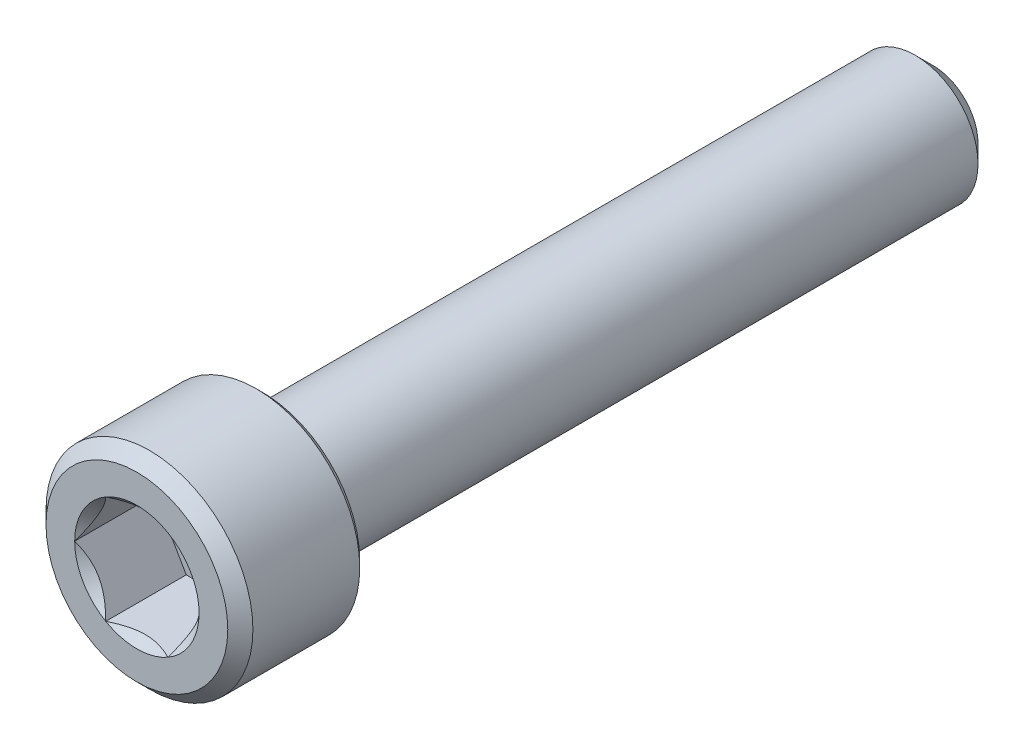
ISO-10303-21;
HEADER;
FILE_DESCRIPTION(('STEP AP214'),'2;1');
FILE_NAME('part.step','',(''),(''),'','','');
FILE_SCHEMA(('AUTOMOTIVE_DESIGN { 1 0 10303 214 1 1 1 1 }'));
ENDSEC;
DATA;
#1=APPLICATION_CONTEXT('core data for automotive mechanical design processes');
#2=APPLICATION_PROTOCOL_DEFINITION('international standard','automotive_design',2000,#1);
#3=PRODUCT_CONTEXT('',#1,'mechanical');
#4=PRODUCT('Part','Part','',(#3));
#5=PRODUCT_RELATED_PRODUCT_CATEGORY('part','',(#4));
#6=PRODUCT_DEFINITION_FORMATION('','',#4);
#7=PRODUCT_DEFINITION_CONTEXT('part definition',#1,'design');
#8=PRODUCT_DEFINITION('design','',#6,#7);
#9=PRODUCT_DEFINITION_SHAPE('','',#8);
#10=(LENGTH_UNIT() NAMED_UNIT(*) SI_UNIT(.MILLI.,.METRE.));
#11=(NAMED_UNIT(*) PLANE_ANGLE_UNIT() SI_UNIT($,.RADIAN.));
#12=(NAMED_UNIT(*) SI_UNIT($,.STERADIAN.) SOLID_ANGLE_UNIT());
#13=UNCERTAINTY_MEASURE_WITH_UNIT(LENGTH_MEASURE(1.E-05),#10,'distance_accuracy_value','');
#14=(GEOMETRIC_REPRESENTATION_CONTEXT(3) GLOBAL_UNCERTAINTY_ASSIGNED_CONTEXT((#13)) GLOBAL_UNIT_ASSIGNED_CONTEXT((#10,
#11,#12)) REPRESENTATION_CONTEXT('',''));
#15=CARTESIAN_POINT('',(0.,0.,0.));
#16=DIRECTION('',(0.,0.,1.));
#17=DIRECTION('',(1.,0.,0.));
#18=AXIS2_PLACEMENT_3D('',#15,#16,#17);
#19=CARTESIAN_POINT('',(0.,0.,23.7236));
#20=DIRECTION('',(0.,0.,1.));
#21=DIRECTION('',(1.,0.,0.));
#22=AXIS2_PLACEMENT_3D('',#19,#20,#21);
#23=PLANE('',#22);
#24=DIRECTION('',(0.5,-0.866025403784438,0.));
#25=VECTOR('',#24,1.);
#26=CARTESIAN_POINT('',(-2.06185637534076,0.,23.7236));
#27=LINE('',#26,#25);
#28=CARTESIAN_POINT('',(-2.06185637534076,0.,23.7236));
#29=VERTEX_POINT('',#28);
#30=CARTESIAN_POINT('',(-1.03092818767038,-1.78562,23.7236));
#31=VERTEX_POINT('',#30);
#32=EDGE_CURVE('E137',#29,#31,#27,.T.);
#33=ORIENTED_EDGE('',*,*,#32,.T.);
#34=DIRECTION('',(1.,0.,0.));
#35=VECTOR('',#34,1.);
#36=CARTESIAN_POINT('',(-1.03092818767038,-1.78562,23.7236));
#37=LINE('',#36,#35);
#38=CARTESIAN_POINT('',(1.03092818767038,-1.78562,23.7236));
#39=VERTEX_POINT('',#38);
#40=EDGE_CURVE('E96',#31,#39,#37,.T.);
#41=ORIENTED_EDGE('',*,*,#40,.T.);
#42=DIRECTION('',(0.5,0.866025403784439,0.));
#43=VECTOR('',#42,1.);
#44=CARTESIAN_POINT('',(1.03092818767038,-1.78562,23.7236));
#45=LINE('',#44,#43);
#46=CARTESIAN_POINT('',(2.06185637534076,0.,23.7236));
#47=VERTEX_POINT('',#46);
#48=EDGE_CURVE('E98',#39,#47,#45,.T.);
#49=ORIENTED_EDGE('',*,*,#48,.T.);
#50=DIRECTION('',(-0.5,0.866025403784439,0.));
#51=VECTOR('',#50,1.);
#52=CARTESIAN_POINT('',(2.06185637534076,0.,23.7236));
#53=LINE('',#52,#51);
#54=CARTESIAN_POINT('',(1.03092818767038,1.78562,23.7236));
#55=VERTEX_POINT('',#54);
#56=EDGE_CURVE('E99',#47,#55,#53,.T.);
#57=ORIENTED_EDGE('',*,*,#56,.T.);
#58=DIRECTION('',(-1.,0.,0.));
#59=VECTOR('',#58,1.);
#60=CARTESIAN_POINT('',(1.03092818767038,1.78562,23.7236));
#61=LINE('',#60,#59);
#62=CARTESIAN_POINT('',(-1.03092818767038,1.78562,23.7236));
#63=VERTEX_POINT('',#62);
#64=EDGE_CURVE('E84',#55,#63,#61,.T.);
#65=ORIENTED_EDGE('',*,*,#64,.T.);
#66=DIRECTION('',(-0.5,-0.866025403784439,0.));
#67=VECTOR('',#66,1.);
#68=CARTESIAN_POINT('',(-1.03092818767038,1.78562,23.7236));
#69=LINE('',#68,#67);
#70=EDGE_CURVE('E131',#63,#29,#69,.T.);
#71=ORIENTED_EDGE('',*,*,#70,.T.);
#72=EDGE_LOOP('',(#33,#41,#49,#57,#65,#71));
#73=FACE_BOUND('',#72,.T.);
#74=ADVANCED_FACE('F16',(#73),#23,.T.);
#75=CARTESIAN_POINT('',(2.06185637534076,0.,23.7236));
#76=DIRECTION('',(0.866025403784439,0.5,0.));
#77=DIRECTION('',(-0.5,0.866025403784439,0.));
#78=AXIS2_PLACEMENT_3D('',#75,#76,#77);
#79=PLANE('',#78);
#80=CARTESIAN_POINT('',(2.06185637533905,2.96035098353382E-12,26.3906000000037));
#81=CARTESIAN_POINT('',(2.026422870073,0.0613726314140151,26.3552004995165));
#82=CARTESIAN_POINT('',(1.9903969158321,0.123771414550414,26.3218804146155));
#83=CARTESIAN_POINT('',(1.91693629807051,0.251008936868882,26.2608727616075));
#84=CARTESIAN_POINT('',(1.8794946522586,0.315859769734103,26.2332191270466));
#85=CARTESIAN_POINT('',(1.80399541010584,0.446628293075627,26.1858482648995));
#86=CARTESIAN_POINT('',(1.76595703078087,0.512512698704056,26.1660120045749));
#87=CARTESIAN_POINT('',(1.68904308953725,0.645731552748382,26.1354504677374));
#88=CARTESIAN_POINT('',(1.6501698755405,0.713061934444245,26.1247023867436));
#89=CARTESIAN_POINT('',(1.58317010137717,0.829108947390773,26.115004588028));
#90=CARTESIAN_POINT('',(1.55513003782776,0.877675762105807,26.1135694330348));
#91=CARTESIAN_POINT('',(1.4990957861819,0.974729932920544,26.1159903582856));
#92=CARTESIAN_POINT('',(1.47110161760792,1.02321725520633,26.1198482931547));
#93=CARTESIAN_POINT('',(1.41538537197289,1.11972062345317,26.1326340723243));
#94=CARTESIAN_POINT('',(1.38766354396524,1.16773623804112,26.1415661844262));
#95=CARTESIAN_POINT('',(1.33268389705735,1.26296377986778,26.1640154678998));
#96=CARTESIAN_POINT('',(1.30542630540845,1.31017531349564,26.1775348206869));
#97=CARTESIAN_POINT('',(1.23563624998306,1.43105523535546,26.2176550620338));
#98=CARTESIAN_POINT('',(1.19353588652336,1.50397520388477,26.2472754050971));
#99=CARTESIAN_POINT('',(1.13163053076597,1.6111984253172,26.2972771620138));
#100=CARTESIAN_POINT('',(1.11122988524144,1.64653337987289,26.3148452543052));
#101=CARTESIAN_POINT('',(1.07080633249752,1.71654902704781,26.3515826683194));
#102=CARTESIAN_POINT('',(1.05078320287471,1.75123010488105,26.3707510087135));
#103=CARTESIAN_POINT('',(1.03092818767209,1.78561999999704,26.3906000000037));
#104=B_SPLINE_CURVE_WITH_KNOTS('',3,(#80,#81,#82,#83,#84,#85,#86,#87,#88,#89,#90,#91,#92,#93,
#94,#95,#96,#97,#98,#99,#100,#101,#102,#103),.UNSPECIFIED.,.F.,.F.,(4,2,2,2,2,2,2,2,2,2,2,4),
(0.,0.237814133072586,0.47701327927137,0.71241475182455,0.947223776267081,1.11528104358778,
1.28339721087923,1.45165498752651,1.61999288983813,1.88720880278978,2.02045430034969,
2.15361867896778),.UNSPECIFIED.);
#105=CARTESIAN_POINT('',(2.06185637534389,1.48011236561959E-12,26.3906000000085));
#106=VERTEX_POINT('',#105);
#107=CARTESIAN_POINT('',(1.03092818767664,1.78562,26.3906000000085));
#108=VERTEX_POINT('',#107);
#109=EDGE_CURVE('E19',#106,#108,#104,.T.);
#110=ORIENTED_EDGE('',*,*,#109,.T.);
#111=DIRECTION('',(0.,0.,1.));
#112=VECTOR('',#111,1.);
#113=CARTESIAN_POINT('',(1.03092818767038,1.78562,23.7236));
#114=LINE('',#113,#112);
#115=EDGE_CURVE('E105',#108,#55,#114,.F.);
#116=ORIENTED_EDGE('',*,*,#115,.T.);
#117=ORIENTED_EDGE('',*,*,#56,.F.);
#118=DIRECTION('',(0.,0.,1.));
#119=VECTOR('',#118,1.);
#120=CARTESIAN_POINT('',(2.06185637534076,0.,23.7236));
#121=LINE('',#120,#119);
#122=EDGE_CURVE('E68',#47,#106,#121,.T.);
#123=ORIENTED_EDGE('',*,*,#122,.T.);
#124=EDGE_LOOP('',(#110,#116,#117,#123));
#125=FACE_BOUND('',#124,.T.);
#126=ADVANCED_FACE('F104',(#125),#79,.F.);
#127=CARTESIAN_POINT('',(1.03092818767038,-1.78562,23.7236));
#128=DIRECTION('',(0.866025403784439,-0.5,0.));
#129=DIRECTION('',(0.5,0.866025403784439,0.));
#130=AXIS2_PLACEMENT_3D('',#127,#128,#129);
#131=PLANE('',#130);
#132=CARTESIAN_POINT('',(1.03092818767209,-1.78561999999704,26.3906000000037));
#133=CARTESIAN_POINT('',(1.06636169293814,-1.72424736858599,26.3552004995165));
#134=CARTESIAN_POINT('',(1.10238764717904,-1.66184858544959,26.3218804146155));
#135=CARTESIAN_POINT('',(1.17584826494063,-1.53461106313112,26.2608727616075));
#136=CARTESIAN_POINT('',(1.21328991075254,-1.4697602302659,26.2332191270466));
#137=CARTESIAN_POINT('',(1.28878915290529,-1.33899170692437,26.1858482648995));
#138=CARTESIAN_POINT('',(1.32682753223027,-1.27310730129595,26.1660120045749));
#139=CARTESIAN_POINT('',(1.40374147347389,-1.13988844725162,26.1354504677374));
#140=CARTESIAN_POINT('',(1.44261468747064,-1.07255806555576,26.1247023867436));
#141=CARTESIAN_POINT('',(1.50961446163397,-0.956511052609227,26.115004588028));
#142=CARTESIAN_POINT('',(1.53765452518338,-0.907944237894194,26.1135694330348));
#143=CARTESIAN_POINT('',(1.59368877682924,-0.810890067079457,26.1159903582856));
#144=CARTESIAN_POINT('',(1.62168294540322,-0.762402744793675,26.1198482931547));
#145=CARTESIAN_POINT('',(1.67739919103824,-0.665899376546829,26.1326340723243));
#146=CARTESIAN_POINT('',(1.7051210190459,-0.617883761958882,26.1415661844262));
#147=CARTESIAN_POINT('',(1.76010066595379,-0.522656220132217,26.1640154678998));
#148=CARTESIAN_POINT('',(1.78735825760269,-0.475444686504363,26.1775348206869));
#149=CARTESIAN_POINT('',(1.85714831302807,-0.354564764644544,26.2176550620338));
#150=CARTESIAN_POINT('',(1.89924867648777,-0.281644796115232,26.2472754050971));
#151=CARTESIAN_POINT('',(1.96115403224517,-0.1744215746828,26.2972771620138));
#152=CARTESIAN_POINT('',(1.9815546777697,-0.139086620127111,26.3148452543052));
#153=CARTESIAN_POINT('',(2.02197823051362,-0.0690709729521904,26.3515826683194));
#154=CARTESIAN_POINT('',(2.04200136013643,-0.0343898951189551,26.3707510087135));
#155=CARTESIAN_POINT('',(2.06185637533905,-2.95938727224559E-12,26.3906000000037));
#156=B_SPLINE_CURVE_WITH_KNOTS('',3,(#132,#133,#134,#135,#136,#137,#138,#139,#140,#141,#142,
#143,#144,#145,#146,#147,#148,#149,#150,#151,#152,#153,#154,#155),.UNSPECIFIED.,.F.,.F.,(4,2,2,
2,2,2,2,2,2,2,2,4),(0.,0.237814133072584,0.477013279271369,0.712414751824548,0.947223776267081,
1.11528104358778,1.28339721087923,1.45165498752651,1.61999288983813,1.88720880278978,
2.02045430034969,2.15361867896778),.UNSPECIFIED.);
#157=CARTESIAN_POINT('',(1.03092818767322,-1.78562000000197,26.3906000000085));
#158=VERTEX_POINT('',#157);
#159=EDGE_CURVE('E110',#158,#106,#156,.T.);
#160=ORIENTED_EDGE('',*,*,#159,.T.);
#161=ORIENTED_EDGE('',*,*,#122,.F.);
#162=ORIENTED_EDGE('',*,*,#48,.F.);
#163=DIRECTION('',(0.,0.,-1.));
#164=VECTOR('',#163,1.);
#165=CARTESIAN_POINT('',(1.03092818767038,-1.78562,23.7236));
#166=LINE('',#165,#164);
#167=EDGE_CURVE('E116',#39,#158,#166,.F.);
#168=ORIENTED_EDGE('',*,*,#167,.T.);
#169=EDGE_LOOP('',(#160,#161,#162,#168));
#170=FACE_BOUND('',#169,.T.);
#171=ADVANCED_FACE('F108',(#170),#131,.F.);
#172=CARTESIAN_POINT('',(-1.03092818767038,-1.78562,23.7236));
#173=DIRECTION('',(0.,-1.,0.));
#174=DIRECTION('',(0.,0.,-1.));
#175=AXIS2_PLACEMENT_3D('',#172,#173,#174);
#176=PLANE('',#175);
#177=CARTESIAN_POINT('',(-1.03092818766696,-1.78562,26.3906000000037));
#178=CARTESIAN_POINT('',(-0.960061177134866,-1.78562,26.3552004995165));
#179=CARTESIAN_POINT('',(-0.888009268653056,-1.78562,26.3218804146155));
#180=CARTESIAN_POINT('',(-0.741088033129878,-1.78562,26.2608727616075));
#181=CARTESIAN_POINT('',(-0.666204741506065,-1.78562,26.2332191270466));
#182=CARTESIAN_POINT('',(-0.515206257200546,-1.78562,26.1858482648995));
#183=CARTESIAN_POINT('',(-0.439129498550602,-1.78562,26.1660120045749));
#184=CARTESIAN_POINT('',(-0.285301616063352,-1.78562,26.1354504677374));
#185=CARTESIAN_POINT('',(-0.207555188069858,-1.78562,26.1247023867436));
#186=CARTESIAN_POINT('',(-0.0735556397431974,-1.78562,26.115004588028));
#187=CARTESIAN_POINT('',(-0.0174755126443825,-1.78562,26.1135694330348));
#188=CARTESIAN_POINT('',(0.094592990647345,-1.78562,26.1159903582856));
#189=CARTESIAN_POINT('',(0.150581327795306,-1.78562,26.1198482931547));
#190=CARTESIAN_POINT('',(0.26201381906535,-1.78562,26.1326340723243));
#191=CARTESIAN_POINT('',(0.317457475080664,-1.78562,26.1415661844262));
#192=CARTESIAN_POINT('',(0.427416768896447,-1.78562,26.1640154678998));
#193=CARTESIAN_POINT('',(0.48193195219424,-1.78562,26.1775348206869));
#194=CARTESIAN_POINT('',(0.621512063045013,-1.78562,26.2176550620338));
#195=CARTESIAN_POINT('',(0.705712789964406,-1.78562,26.2472754050971));
#196=CARTESIAN_POINT('',(0.829523501479193,-1.78562,26.2972771620138));
#197=CARTESIAN_POINT('',(0.870324792528254,-1.78562,26.3148452543052));
#198=CARTESIAN_POINT('',(0.951171898016107,-1.78562,26.3515826683194));
#199=CARTESIAN_POINT('',(0.991218157261715,-1.78562,26.3707510087135));
#200=CARTESIAN_POINT('',(1.03092818766696,-1.78562,26.3906000000037));
#201=B_SPLINE_CURVE_WITH_KNOTS('',3,(#177,#178,#179,#180,#181,#182,#183,#184,#185,#186,#187,
#188,#189,#190,#191,#192,#193,#194,#195,#196,#197,#198,#199,#200),.UNSPECIFIED.,.F.,.F.,(4,2,2,
2,2,2,2,2,2,2,2,4),(0.,0.237814133072586,0.47701327927137,0.712414751824552,0.947223776267083,
1.11528104358778,1.28339721087923,1.45165498752651,1.61999288983813,1.88720880278978,
2.02045430034969,2.15361867896778),.UNSPECIFIED.);
#202=CARTESIAN_POINT('',(-1.03092818767323,-1.78562000000197,26.3906000000085));
#203=VERTEX_POINT('',#202);
#204=EDGE_CURVE('E235',#203,#158,#201,.T.);
#205=ORIENTED_EDGE('',*,*,#204,.T.);
#206=ORIENTED_EDGE('',*,*,#167,.F.);
#207=ORIENTED_EDGE('',*,*,#40,.F.);
#208=DIRECTION('',(0.,0.,1.));
#209=VECTOR('',#208,1.);
#210=CARTESIAN_POINT('',(-1.03092818767038,-1.78562,23.7236));
#211=LINE('',#210,#209);
#212=EDGE_CURVE('E134',#31,#203,#211,.T.);
#213=ORIENTED_EDGE('',*,*,#212,.T.);
#214=EDGE_LOOP('',(#205,#206,#207,#213));
#215=FACE_BOUND('',#214,.T.);
#216=ADVANCED_FACE('F245',(#215),#176,.F.);
#217=CARTESIAN_POINT('',(-2.06185637534076,0.,23.7236));
#218=DIRECTION('',(-0.866025403784438,-0.5,0.));
#219=DIRECTION('',(0.5,-0.866025403784438,0.));
#220=AXIS2_PLACEMENT_3D('',#217,#218,#219);
#221=PLANE('',#220);
#222=CARTESIAN_POINT('',(-2.06185637533905,-2.95934489864453E-12,26.3906000000037));
#223=CARTESIAN_POINT('',(-2.026422870073,-0.0613726314140125,26.3552004995165));
#224=CARTESIAN_POINT('',(-1.9903969158321,-0.123771414550412,26.3218804146155));
#225=CARTESIAN_POINT('',(-1.91693629807051,-0.251008936868881,26.2608727616075));
#226=CARTESIAN_POINT('',(-1.8794946522586,-0.315859769734102,26.2332191270466));
#227=CARTESIAN_POINT('',(-1.80399541010584,-0.446628293075627,26.1858482648995));
#228=CARTESIAN_POINT('',(-1.76595703078087,-0.512512698704056,26.1660120045749));
#229=CARTESIAN_POINT('',(-1.68904308953725,-0.645731552748383,26.1354504677374));
#230=CARTESIAN_POINT('',(-1.6501698755405,-0.713061934444247,26.1247023867436));
#231=CARTESIAN_POINT('',(-1.58317010137717,-0.829108947390775,26.115004588028));
#232=CARTESIAN_POINT('',(-1.55513003782776,-0.877675762105809,26.1135694330348));
#233=CARTESIAN_POINT('',(-1.4990957861819,-0.974729932920546,26.1159903582856));
#234=CARTESIAN_POINT('',(-1.47110161760792,-1.02321725520633,26.1198482931547));
#235=CARTESIAN_POINT('',(-1.41538537197289,-1.11972062345317,26.1326340723243));
#236=CARTESIAN_POINT('',(-1.38766354396524,-1.16773623804112,26.1415661844262));
#237=CARTESIAN_POINT('',(-1.33268389705734,-1.26296377986779,26.1640154678998));
#238=CARTESIAN_POINT('',(-1.30542630540845,-1.31017531349564,26.1775348206869));
#239=CARTESIAN_POINT('',(-1.23563624998306,-1.43105523535546,26.2176550620338));
#240=CARTESIAN_POINT('',(-1.19353588652336,-1.50397520388477,26.2472754050971));
#241=CARTESIAN_POINT('',(-1.13163053076597,-1.6111984253172,26.2972771620138));
#242=CARTESIAN_POINT('',(-1.11122988524144,-1.64653337987289,26.3148452543052));
#243=CARTESIAN_POINT('',(-1.07080633249751,-1.71654902704781,26.3515826683194));
#244=CARTESIAN_POINT('',(-1.05078320287471,-1.75123010488104,26.3707510087135));
#245=CARTESIAN_POINT('',(-1.03092818767209,-1.78561999999704,26.3906000000037));
#246=B_SPLINE_CURVE_WITH_KNOTS('',3,(#222,#223,#224,#225,#226,#227,#228,#229,#230,#231,#232,
#233,#234,#235,#236,#237,#238,#239,#240,#241,#242,#243,#244,#245),.UNSPECIFIED.,.F.,.F.,(4,2,2,
2,2,2,2,2,2,2,2,4),(0.,0.237814133072586,0.477013279271371,0.712414751824553,0.947223776267086,
1.11528104358779,1.28339721087923,1.45165498752651,1.61999288983813,1.88720880278978,
2.02045430034969,2.15361867896778),.UNSPECIFIED.);
#247=CARTESIAN_POINT('',(-2.06185637534389,1.4815809195694E-12,26.3906000000085));
#248=VERTEX_POINT('',#247);
#249=EDGE_CURVE('E226',#248,#203,#246,.T.);
#250=ORIENTED_EDGE('',*,*,#249,.T.);
#251=ORIENTED_EDGE('',*,*,#212,.F.);
#252=ORIENTED_EDGE('',*,*,#32,.F.);
#253=DIRECTION('',(0.,0.,1.));
#254=VECTOR('',#253,1.);
#255=CARTESIAN_POINT('',(-2.06185637534076,0.,23.7236));
#256=LINE('',#255,#254);
#257=EDGE_CURVE('E128',#29,#248,#256,.T.);
#258=ORIENTED_EDGE('',*,*,#257,.T.);
#259=EDGE_LOOP('',(#250,#251,#252,#258));
#260=FACE_BOUND('',#259,.T.);
#261=ADVANCED_FACE('F241',(#260),#221,.F.);
#262=CARTESIAN_POINT('',(-1.03092818767038,1.78562,23.7236));
#263=DIRECTION('',(-0.866025403784439,0.5,0.));
#264=DIRECTION('',(-0.5,-0.866025403784439,0.));
#265=AXIS2_PLACEMENT_3D('',#262,#263,#264);
#266=PLANE('',#265);
#267=CARTESIAN_POINT('',(-1.03092818767209,1.78561999999704,26.3906000000037));
#268=CARTESIAN_POINT('',(-1.06636169293814,1.72424736858599,26.3552004995165));
#269=CARTESIAN_POINT('',(-1.10238764717904,1.66184858544959,26.3218804146155));
#270=CARTESIAN_POINT('',(-1.17584826494063,1.53461106313112,26.2608727616075));
#271=CARTESIAN_POINT('',(-1.21328991075254,1.4697602302659,26.2332191270466));
#272=CARTESIAN_POINT('',(-1.28878915290529,1.33899170692438,26.1858482648995));
#273=CARTESIAN_POINT('',(-1.32682753223027,1.27310730129595,26.1660120045749));
#274=CARTESIAN_POINT('',(-1.40374147347389,1.13988844725162,26.1354504677374));
#275=CARTESIAN_POINT('',(-1.44261468747064,1.07255806555576,26.1247023867436));
#276=CARTESIAN_POINT('',(-1.50961446163397,0.956511052609228,26.115004588028));
#277=CARTESIAN_POINT('',(-1.53765452518338,0.907944237894194,26.1135694330348));
#278=CARTESIAN_POINT('',(-1.59368877682924,0.810890067079458,26.1159903582856));
#279=CARTESIAN_POINT('',(-1.62168294540322,0.762402744793675,26.1198482931547));
#280=CARTESIAN_POINT('',(-1.67739919103824,0.66589937654683,26.1326340723243));
#281=CARTESIAN_POINT('',(-1.7051210190459,0.617883761958882,26.1415661844262));
#282=CARTESIAN_POINT('',(-1.76010066595379,0.522656220132217,26.1640154678998));
#283=CARTESIAN_POINT('',(-1.78735825760269,0.475444686504363,26.1775348206869));
#284=CARTESIAN_POINT('',(-1.85714831302807,0.354564764644545,26.2176550620338));
#285=CARTESIAN_POINT('',(-1.89924867648777,0.281644796115233,26.2472754050971));
#286=CARTESIAN_POINT('',(-1.96115403224517,0.174421574682801,26.2972771620138));
#287=CARTESIAN_POINT('',(-1.9815546777697,0.139086620127112,26.3148452543052));
#288=CARTESIAN_POINT('',(-2.02197823051362,0.0690709729521915,26.3515826683194));
#289=CARTESIAN_POINT('',(-2.04200136013643,0.0343898951189564,26.3707510087135));
#290=CARTESIAN_POINT('',(-2.06185637533905,2.96105912339205E-12,26.3906000000037));
#291=B_SPLINE_CURVE_WITH_KNOTS('',3,(#267,#268,#269,#270,#271,#272,#273,#274,#275,#276,#277,
#278,#279,#280,#281,#282,#283,#284,#285,#286,#287,#288,#289,#290),.UNSPECIFIED.,.F.,.F.,(4,2,2,
2,2,2,2,2,2,2,2,4),(0.,0.237814133072586,0.477013279271369,0.712414751824548,0.94722377626708,
1.11528104358778,1.28339721087923,1.45165498752651,1.61999288983813,1.88720880278978,
2.02045430034969,2.15361867896778),.UNSPECIFIED.);
#292=CARTESIAN_POINT('',(-1.03092818767066,1.78562000000345,26.3906000000085));
#293=VERTEX_POINT('',#292);
#294=EDGE_CURVE('E196',#293,#248,#291,.T.);
#295=ORIENTED_EDGE('',*,*,#294,.T.);
#296=ORIENTED_EDGE('',*,*,#257,.F.);
#297=ORIENTED_EDGE('',*,*,#70,.F.);
#298=DIRECTION('',(0.,0.,1.));
#299=VECTOR('',#298,1.);
#300=CARTESIAN_POINT('',(-1.03092818767038,1.78562,23.7236));
#301=LINE('',#300,#299);
#302=EDGE_CURVE('E44',#63,#293,#301,.T.);
#303=ORIENTED_EDGE('',*,*,#302,.T.);
#304=EDGE_LOOP('',(#295,#296,#297,#303));
#305=FACE_BOUND('',#304,.T.);
#306=ADVANCED_FACE('F244',(#305),#266,.F.);
#307=CARTESIAN_POINT('',(1.03092818767038,1.78562,23.7236));
#308=DIRECTION('',(0.,1.,0.));
#309=DIRECTION('',(-1.,0.,0.));
#310=AXIS2_PLACEMENT_3D('',#307,#308,#309);
#311=PLANE('',#310);
#312=CARTESIAN_POINT('',(1.03092818766696,1.78562,26.3906000000037));
#313=CARTESIAN_POINT('',(0.960061177134866,1.78562,26.3552004995165));
#314=CARTESIAN_POINT('',(0.888009268653057,1.78562,26.3218804146155));
#315=CARTESIAN_POINT('',(0.74108803312988,1.78562,26.2608727616075));
#316=CARTESIAN_POINT('',(0.666204741506068,1.78562,26.2332191270466));
#317=CARTESIAN_POINT('',(0.515206257200549,1.78562,26.1858482648995));
#318=CARTESIAN_POINT('',(0.439129498550605,1.78562,26.1660120045749));
#319=CARTESIAN_POINT('',(0.285301616063355,1.78562,26.1354504677374));
#320=CARTESIAN_POINT('',(0.207555188069861,1.78562,26.1247023867436));
#321=CARTESIAN_POINT('',(0.0735556397432007,1.78562,26.115004588028));
#322=CARTESIAN_POINT('',(0.0174755126443856,1.78562,26.1135694330348));
#323=CARTESIAN_POINT('',(-0.0945929906473424,1.78562,26.1159903582856));
#324=CARTESIAN_POINT('',(-0.150581327795304,1.78562,26.1198482931547));
#325=CARTESIAN_POINT('',(-0.262013819065348,1.78562,26.1326340723243));
#326=CARTESIAN_POINT('',(-0.317457475080661,1.78562,26.1415661844262));
#327=CARTESIAN_POINT('',(-0.427416768896445,1.78562,26.1640154678998));
#328=CARTESIAN_POINT('',(-0.481931952194238,1.78562,26.1775348206869));
#329=CARTESIAN_POINT('',(-0.621512063045012,1.78562,26.2176550620338));
#330=CARTESIAN_POINT('',(-0.705712789964407,1.78562,26.2472754050971));
#331=CARTESIAN_POINT('',(-0.829523501479194,1.78562,26.2972771620138));
#332=CARTESIAN_POINT('',(-0.870324792528254,1.78562,26.3148452543052));
#333=CARTESIAN_POINT('',(-0.951171898016107,1.78562,26.3515826683194));
#334=CARTESIAN_POINT('',(-0.991218157261716,1.78562,26.3707510087135));
#335=CARTESIAN_POINT('',(-1.03092818766696,1.78562,26.3906000000037));
#336=B_SPLINE_CURVE_WITH_KNOTS('',3,(#312,#313,#314,#315,#316,#317,#318,#319,#320,#321,#322,
#323,#324,#325,#326,#327,#328,#329,#330,#331,#332,#333,#334,#335),.UNSPECIFIED.,.F.,.F.,(4,2,2,
2,2,2,2,2,2,2,2,4),(0.,0.237814133072585,0.477013279271368,0.712414751824549,0.947223776267081,
1.11528104358778,1.28339721087923,1.45165498752651,1.61999288983813,1.88720880278978,
2.02045430034969,2.15361867896778),.UNSPECIFIED.);
#337=EDGE_CURVE('E187',#108,#293,#336,.T.);
#338=ORIENTED_EDGE('',*,*,#337,.T.);
#339=ORIENTED_EDGE('',*,*,#302,.F.);
#340=ORIENTED_EDGE('',*,*,#64,.F.);
#341=ORIENTED_EDGE('',*,*,#115,.F.);
#342=EDGE_LOOP('',(#338,#339,#340,#341));
#343=FACE_BOUND('',#342,.T.);
#344=ADVANCED_FACE('F204',(#343),#311,.F.);
#345=CARTESIAN_POINT('',(0.,0.,26.3905999998997));
#346=DIRECTION('',(0.,0.,1.));
#347=DIRECTION('',(0.,-1.,0.));
#348=AXIS2_PLACEMENT_3D('',#345,#346,#347);
#349=CONICAL_SURFACE('',#348,2.06185637523504,0.785398163397448);
#350=ORIENTED_EDGE('',*,*,#109,.F.);
#351=CARTESIAN_POINT('',(0.,0.,26.3906000000134));
#352=DIRECTION('',(0.,0.,1.));
#353=DIRECTION('',(0.,-1.,0.));
#354=AXIS2_PLACEMENT_3D('',#351,#352,#353);
#355=CIRCLE('',#354,2.06185637534873);
#356=EDGE_CURVE('E183',#108,#106,#355,.F.);
#357=ORIENTED_EDGE('',*,*,#356,.F.);
#358=EDGE_LOOP('',(#350,#357));
#359=FACE_BOUND('',#358,.T.);
#360=ADVANCED_FACE('F263',(#359),#349,.F.);
#361=CARTESIAN_POINT('',(0.,0.,26.3905999998997));
#362=DIRECTION('',(0.,0.,1.));
#363=DIRECTION('',(0.,-1.,0.));
#364=AXIS2_PLACEMENT_3D('',#361,#362,#363);
#365=CONICAL_SURFACE('',#364,2.06185637523504,0.785398163397448);
#366=ORIENTED_EDGE('',*,*,#159,.F.);
#367=CARTESIAN_POINT('',(0.,0.,26.3906000000134));
#368=DIRECTION('',(0.,0.,1.));
#369=DIRECTION('',(0.,-1.,0.));
#370=AXIS2_PLACEMENT_3D('',#367,#368,#369);
#371=CIRCLE('',#370,2.06185637534873);
#372=EDGE_CURVE('E179',#106,#158,#371,.F.);
#373=ORIENTED_EDGE('',*,*,#372,.F.);
#374=EDGE_LOOP('',(#366,#373));
#375=FACE_BOUND('',#374,.T.);
#376=ADVANCED_FACE('F260',(#375),#365,.F.);
#377=CARTESIAN_POINT('',(0.,0.,26.3905999998997));
#378=DIRECTION('',(0.,0.,1.));
#379=DIRECTION('',(0.,-1.,0.));
#380=AXIS2_PLACEMENT_3D('',#377,#378,#379);
#381=CONICAL_SURFACE('',#380,2.06185637523504,0.785398163397448);
#382=ORIENTED_EDGE('',*,*,#204,.F.);
#383=CARTESIAN_POINT('',(0.,0.,26.3906000000134));
#384=DIRECTION('',(0.,0.,1.));
#385=DIRECTION('',(0.,-1.,0.));
#386=AXIS2_PLACEMENT_3D('',#383,#384,#385);
#387=CIRCLE('',#386,2.06185637534873);
#388=EDGE_CURVE('E175',#158,#203,#387,.F.);
#389=ORIENTED_EDGE('',*,*,#388,.F.);
#390=EDGE_LOOP('',(#382,#389));
#391=FACE_BOUND('',#390,.T.);
#392=ADVANCED_FACE('F222',(#391),#381,.F.);
#393=CARTESIAN_POINT('',(0.,0.,26.3905999998997));
#394=DIRECTION('',(0.,0.,1.));
#395=DIRECTION('',(0.,-1.,0.));
#396=AXIS2_PLACEMENT_3D('',#393,#394,#395);
#397=CONICAL_SURFACE('',#396,2.06185637523504,0.785398163397448);
#398=ORIENTED_EDGE('',*,*,#249,.F.);
#399=CARTESIAN_POINT('',(0.,0.,26.3906000000134));
#400=DIRECTION('',(0.,0.,1.));
#401=DIRECTION('',(0.,-1.,0.));
#402=AXIS2_PLACEMENT_3D('',#399,#400,#401);
#403=CIRCLE('',#402,2.06185637534873);
#404=EDGE_CURVE('E171',#203,#248,#403,.F.);
#405=ORIENTED_EDGE('',*,*,#404,.F.);
#406=EDGE_LOOP('',(#398,#405));
#407=FACE_BOUND('',#406,.T.);
#408=ADVANCED_FACE('F217',(#407),#397,.F.);
#409=CARTESIAN_POINT('',(0.,0.,26.3905999998997));
#410=DIRECTION('',(0.,0.,1.));
#411=DIRECTION('',(0.,-1.,0.));
#412=AXIS2_PLACEMENT_3D('',#409,#410,#411);
#413=CONICAL_SURFACE('',#412,2.06185637523504,0.785398163397448);
#414=ORIENTED_EDGE('',*,*,#294,.F.);
#415=CARTESIAN_POINT('',(0.,0.,26.3906000000134));
#416=DIRECTION('',(0.,0.,1.));
#417=DIRECTION('',(0.,-1.,0.));
#418=AXIS2_PLACEMENT_3D('',#415,#416,#417);
#419=CIRCLE('',#418,2.06185637534873);
#420=EDGE_CURVE('E167',#248,#293,#419,.F.);
#421=ORIENTED_EDGE('',*,*,#420,.F.);
#422=EDGE_LOOP('',(#414,#421));
#423=FACE_BOUND('',#422,.T.);
#424=ADVANCED_FACE('F211',(#423),#413,.F.);
#425=CARTESIAN_POINT('',(0.,0.,26.3905999998997));
#426=DIRECTION('',(0.,0.,1.));
#427=DIRECTION('',(0.,-1.,0.));
#428=AXIS2_PLACEMENT_3D('',#425,#426,#427);
#429=CONICAL_SURFACE('',#428,2.06185637523504,0.785398163397448);
#430=ORIENTED_EDGE('',*,*,#337,.F.);
#431=CARTESIAN_POINT('',(0.,0.,26.3906000000134));
#432=DIRECTION('',(0.,0.,1.));
#433=DIRECTION('',(0.,-1.,0.));
#434=AXIS2_PLACEMENT_3D('',#431,#432,#433);
#435=CIRCLE('',#434,2.06185637534873);
#436=EDGE_CURVE('E163',#293,#108,#435,.F.);
#437=ORIENTED_EDGE('',*,*,#436,.F.);
#438=EDGE_LOOP('',(#430,#437));
#439=FACE_BOUND('',#438,.T.);
#440=ADVANCED_FACE('F206',(#439),#429,.F.);
#441=CARTESIAN_POINT('',(0.,0.,26.3906));
#442=DIRECTION('',(0.,0.,1.));
#443=DIRECTION('',(1.,0.,0.));
#444=AXIS2_PLACEMENT_3D('',#441,#442,#443);
#445=PLANE('',#444);
#446=CARTESIAN_POINT('',(0.,0.,26.3906000000134));
#447=DIRECTION('',(0.,0.,-1.));
#448=DIRECTION('',(0.,1.,0.));
#449=AXIS2_PLACEMENT_3D('',#446,#447,#448);
#450=CIRCLE('',#449,3.01244000007728);
#451=CARTESIAN_POINT('',(0.,3.01244000007728,26.3906000000134));
#452=VERTEX_POINT('',#451);
#453=EDGE_CURVE('E158',#452,#452,#450,.T.);
#454=ORIENTED_EDGE('',*,*,#453,.F.);
#455=EDGE_LOOP('',(#454));
#456=FACE_BOUND('',#455,.T.);
#457=ORIENTED_EDGE('',*,*,#420,.T.);
#458=ORIENTED_EDGE('',*,*,#436,.T.);
#459=ORIENTED_EDGE('',*,*,#356,.T.);
#460=ORIENTED_EDGE('',*,*,#372,.T.);
#461=ORIENTED_EDGE('',*,*,#388,.T.);
#462=ORIENTED_EDGE('',*,*,#404,.T.);
#463=EDGE_LOOP('',(#457,#458,#459,#460,#461,#462));
#464=FACE_BOUND('',#463,.T.);
#465=ADVANCED_FACE('F210',(#456,#464),#445,.T.);
#466=CARTESIAN_POINT('',(0.,0.,25.974040000051));
#467=DIRECTION('',(0.,0.,-1.));
#468=DIRECTION('',(0.,1.,0.));
#469=AXIS2_PLACEMENT_3D('',#466,#467,#468);
#470=CONICAL_SURFACE('',#469,3.42900000003965,0.785398163397448);
#471=ORIENTED_EDGE('',*,*,#453,.T.);
#472=EDGE_LOOP('',(#471));
#473=FACE_BOUND('',#472,.T.);
#474=CARTESIAN_POINT('',(0.,0.,25.97404));
#475=DIRECTION('',(0.,0.,-1.));
#476=DIRECTION('',(-1.,0.,0.));
#477=AXIS2_PLACEMENT_3D('',#474,#475,#476);
#478=CIRCLE('',#477,3.429);
#479=CARTESIAN_POINT('',(-3.429,0.,25.97404));
#480=VERTEX_POINT('',#479);
#481=EDGE_CURVE('E162',#480,#480,#478,.T.);
#482=ORIENTED_EDGE('',*,*,#481,.F.);
#483=EDGE_LOOP('',(#482));
#484=FACE_BOUND('',#483,.T.);
#485=ADVANCED_FACE('F299',(#473,#484),#470,.T.);
#486=CARTESIAN_POINT('',(0.,0.,26.3906));
#487=DIRECTION('',(0.,0.,-1.));
#488=DIRECTION('',(-1.,0.,0.));
#489=AXIS2_PLACEMENT_3D('',#486,#487,#488);
#490=CYLINDRICAL_SURFACE('',#489,3.429);
#491=ORIENTED_EDGE('',*,*,#481,.T.);
#492=EDGE_LOOP('',(#491));
#493=FACE_BOUND('',#492,.T.);
#494=CARTESIAN_POINT('',(0.,0.,22.4332799999729));
#495=DIRECTION('',(0.,0.,1.));
#496=DIRECTION('',(1.,0.,0.));
#497=AXIS2_PLACEMENT_3D('',#494,#495,#496);
#498=CIRCLE('',#497,3.42899999998281);
#499=CARTESIAN_POINT('',(3.42899999998281,0.,22.4332799999729));
#500=VERTEX_POINT('',#499);
#501=EDGE_CURVE('E157',#500,#500,#498,.F.);
#502=ORIENTED_EDGE('',*,*,#501,.F.);
#503=EDGE_LOOP('',(#502));
#504=FACE_BOUND('',#503,.T.);
#505=ADVANCED_FACE('F296',(#493,#504),#490,.T.);
#506=CARTESIAN_POINT('',(0.,0.,22.4332799999729));
#507=DIRECTION('',(0.,0.,1.));
#508=DIRECTION('',(1.,0.,0.));
#509=AXIS2_PLACEMENT_3D('',#506,#507,#508);
#510=CONICAL_SURFACE('',#509,3.42899999998281,0.785398163397448);
#511=CARTESIAN_POINT('',(0.,0.,22.2249999999917));
#512=DIRECTION('',(0.,0.,1.));
#513=DIRECTION('',(1.,0.,0.));
#514=AXIS2_PLACEMENT_3D('',#511,#512,#513);
#515=CIRCLE('',#514,3.22072000000162);
#516=CARTESIAN_POINT('',(3.22072000000162,0.,22.2249999999917));
#517=VERTEX_POINT('',#516);
#518=EDGE_CURVE('E153',#517,#517,#515,.T.);
#519=ORIENTED_EDGE('',*,*,#518,.T.);
#520=EDGE_LOOP('',(#519));
#521=FACE_BOUND('',#520,.T.);
#522=ORIENTED_EDGE('',*,*,#501,.T.);
#523=EDGE_LOOP('',(#522));
#524=FACE_BOUND('',#523,.T.);
#525=ADVANCED_FACE('F292',(#521,#524),#510,.T.);
#526=CARTESIAN_POINT('',(0.,0.,0.));
#527=DIRECTION('',(0.,0.,1.));
#528=DIRECTION('',(1.,0.,0.));
#529=AXIS2_PLACEMENT_3D('',#526,#527,#528);
#530=PLANE('',#529);
#531=CARTESIAN_POINT('',(0.,0.,0.));
#532=DIRECTION('',(0.,0.,1.));
#533=DIRECTION('',(1.,0.,0.));
#534=AXIS2_PLACEMENT_3D('',#531,#532,#533);
#535=CIRCLE('',#534,1.48844000005965);
#536=CARTESIAN_POINT('',(1.48844000005965,0.,0.));
#537=VERTEX_POINT('',#536);
#538=EDGE_CURVE('E149',#537,#537,#535,.T.);
#539=ORIENTED_EDGE('',*,*,#538,.F.);
#540=EDGE_LOOP('',(#539));
#541=FACE_BOUND('',#540,.T.);
#542=ADVANCED_FACE('F288',(#541),#530,.F.);
#543=CARTESIAN_POINT('',(0.,0.,22.225));
#544=DIRECTION('',(0.,0.,1.));
#545=DIRECTION('',(1.,0.,0.));
#546=AXIS2_PLACEMENT_3D('',#543,#544,#545);
#547=PLANE('',#546);
#548=CARTESIAN_POINT('',(0.,0.,22.225));
#549=DIRECTION('',(0.,0.,-1.));
#550=DIRECTION('',(-1.,0.,0.));
#551=AXIS2_PLACEMENT_3D('',#548,#549,#550);
#552=CIRCLE('',#551,2.0828);
#553=CARTESIAN_POINT('',(-2.0828,0.,22.225));
#554=VERTEX_POINT('',#553);
#555=EDGE_CURVE('E31',#554,#554,#552,.T.);
#556=ORIENTED_EDGE('',*,*,#555,.F.);
#557=EDGE_LOOP('',(#556));
#558=FACE_BOUND('',#557,.T.);
#559=ORIENTED_EDGE('',*,*,#518,.F.);
#560=EDGE_LOOP('',(#559));
#561=FACE_BOUND('',#560,.T.);
#562=ADVANCED_FACE('F281',(#558,#561),#547,.F.);
#563=CARTESIAN_POINT('',(0.,0.,0.594360000036431));
#564=DIRECTION('',(0.,0.,1.));
#565=DIRECTION('',(1.,0.,0.));
#566=AXIS2_PLACEMENT_3D('',#563,#564,#565);
#567=CONICAL_SURFACE('',#566,2.08280000003924,0.785398163349629);
#568=CARTESIAN_POINT('',(0.,0.,0.594360000000006));
#569=DIRECTION('',(0.,0.,-1.));
#570=DIRECTION('',(-1.,0.,0.));
#571=AXIS2_PLACEMENT_3D('',#568,#569,#570);
#572=CIRCLE('',#571,2.0828);
#573=CARTESIAN_POINT('',(-2.0828,0.,0.594360000000006));
#574=VERTEX_POINT('',#573);
#575=EDGE_CURVE('E11',#574,#574,#572,.F.);
#576=ORIENTED_EDGE('',*,*,#575,.F.);
#577=EDGE_LOOP('',(#576));
#578=FACE_BOUND('',#577,.T.);
#579=ORIENTED_EDGE('',*,*,#538,.T.);
#580=EDGE_LOOP('',(#579));
#581=FACE_BOUND('',#580,.T.);
#582=ADVANCED_FACE('F275',(#578,#581),#567,.T.);
#583=CARTESIAN_POINT('',(0.,0.,22.225));
#584=DIRECTION('',(0.,0.,-1.));
#585=DIRECTION('',(-1.,0.,0.));
#586=AXIS2_PLACEMENT_3D('',#583,#584,#585);
#587=CYLINDRICAL_SURFACE('',#586,2.0828);
#588=ORIENTED_EDGE('',*,*,#575,.T.);
#589=EDGE_LOOP('',(#588));
#590=FACE_BOUND('',#589,.T.);
#591=ORIENTED_EDGE('',*,*,#555,.T.);
#592=EDGE_LOOP('',(#591));
#593=FACE_BOUND('',#592,.T.);
#594=ADVANCED_FACE('F273',(#590,#593),#587,.T.);
#595=CLOSED_SHELL('',(#74,#126,#171,#216,#261,#306,#344,#360,#376,#392,#408,#424,#440,#465,#485,
#505,#525,#542,#562,#582,#594));
#596=MANIFOLD_SOLID_BREP('B1',#595);
#597=ADVANCED_BREP_SHAPE_REPRESENTATION('',(#18,#596),#14);
#598=SHAPE_DEFINITION_REPRESENTATION(#9,#597);
ENDSEC;
END-ISO-10303-21;
